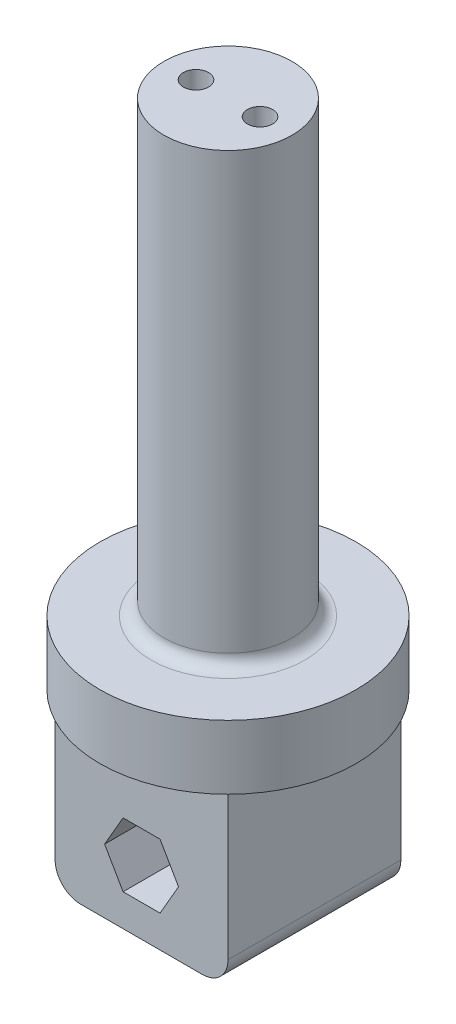
ISO-10303-21;
HEADER;
FILE_DESCRIPTION(('STEP AP214'),'2;1');
FILE_NAME('part.step','',(''),(''),'','','');
FILE_SCHEMA(('AUTOMOTIVE_DESIGN { 1 0 10303 214 1 1 1 1 }'));
ENDSEC;
DATA;
#1=APPLICATION_CONTEXT('core data for automotive mechanical design processes');
#2=APPLICATION_PROTOCOL_DEFINITION('international standard','automotive_design',2000,#1);
#3=PRODUCT_CONTEXT('',#1,'mechanical');
#4=PRODUCT('Part','Part','',(#3));
#5=PRODUCT_RELATED_PRODUCT_CATEGORY('part','',(#4));
#6=PRODUCT_DEFINITION_FORMATION('','',#4);
#7=PRODUCT_DEFINITION_CONTEXT('part definition',#1,'design');
#8=PRODUCT_DEFINITION('design','',#6,#7);
#9=PRODUCT_DEFINITION_SHAPE('','',#8);
#10=(LENGTH_UNIT() NAMED_UNIT(*) SI_UNIT(.MILLI.,.METRE.));
#11=(NAMED_UNIT(*) PLANE_ANGLE_UNIT() SI_UNIT($,.RADIAN.));
#12=(NAMED_UNIT(*) SI_UNIT($,.STERADIAN.) SOLID_ANGLE_UNIT());
#13=UNCERTAINTY_MEASURE_WITH_UNIT(LENGTH_MEASURE(1.E-05),#10,'distance_accuracy_value','');
#14=(GEOMETRIC_REPRESENTATION_CONTEXT(3) GLOBAL_UNCERTAINTY_ASSIGNED_CONTEXT((#13)) GLOBAL_UNIT_ASSIGNED_CONTEXT((#10,
#11,#12)) REPRESENTATION_CONTEXT('',''));
#15=CARTESIAN_POINT('',(0.,0.,0.));
#16=DIRECTION('',(0.,0.,1.));
#17=DIRECTION('',(1.,0.,0.));
#18=AXIS2_PLACEMENT_3D('',#15,#16,#17);
#19=CARTESIAN_POINT('',(17.145,34.31697226,0.));
#20=DIRECTION('',(-1.,0.,0.));
#21=DIRECTION('',(0.,0.,1.));
#22=AXIS2_PLACEMENT_3D('',#19,#20,#21);
#23=PLANE('',#22);
#24=DIRECTION('',(0.,-1.,0.));
#25=VECTOR('',#24,1.);
#26=CARTESIAN_POINT('',(17.145,34.31697226,17.145));
#27=LINE('',#26,#25);
#28=CARTESIAN_POINT('',(17.145,34.31697226,17.145));
#29=VERTEX_POINT('',#28);
#30=CARTESIAN_POINT('',(17.145,5.08,17.145));
#31=VERTEX_POINT('',#30);
#32=EDGE_CURVE('E227',#29,#31,#27,.T.);
#33=ORIENTED_EDGE('',*,*,#32,.T.);
#34=DIRECTION('',(0.,0.,-1.));
#35=VECTOR('',#34,1.);
#36=CARTESIAN_POINT('',(17.145,5.08,0.));
#37=LINE('',#36,#35);
#38=CARTESIAN_POINT('',(17.145,5.08,-17.145));
#39=VERTEX_POINT('',#38);
#40=EDGE_CURVE('E242',#31,#39,#37,.T.);
#41=ORIENTED_EDGE('',*,*,#40,.T.);
#42=DIRECTION('',(0.,-1.,0.));
#43=VECTOR('',#42,1.);
#44=CARTESIAN_POINT('',(17.145,34.31697226,-17.145));
#45=LINE('',#44,#43);
#46=CARTESIAN_POINT('',(17.145,34.31697226,-17.145));
#47=VERTEX_POINT('',#46);
#48=EDGE_CURVE('E239',#47,#39,#45,.T.);
#49=ORIENTED_EDGE('',*,*,#48,.F.);
#50=DIRECTION('',(0.,0.,-1.));
#51=VECTOR('',#50,1.);
#52=CARTESIAN_POINT('',(17.145,34.31697226,17.145));
#53=LINE('',#52,#51);
#54=EDGE_CURVE('E214',#29,#47,#53,.T.);
#55=ORIENTED_EDGE('',*,*,#54,.F.);
#56=EDGE_LOOP('',(#33,#41,#49,#55));
#57=FACE_BOUND('',#56,.T.);
#58=ADVANCED_FACE('F39',(#57),#23,.F.);
#59=CARTESIAN_POINT('',(0.,34.31697226,-17.145));
#60=DIRECTION('',(0.,0.,1.));
#61=DIRECTION('',(1.,0.,0.));
#62=AXIS2_PLACEMENT_3D('',#59,#60,#61);
#63=PLANE('',#62);
#64=DIRECTION('',(0.5,-0.866025403784439,0.));
#65=VECTOR('',#64,1.);
#66=CARTESIAN_POINT('',(-14.8596848790629,25.737729195,-17.145));
#67=LINE('',#66,#65);
#68=CARTESIAN_POINT('',(-7.33234841870825,12.7,-17.145));
#69=VERTEX_POINT('',#68);
#70=CARTESIAN_POINT('',(-3.66617420935412,6.35,-17.145));
#71=VERTEX_POINT('',#70);
#72=EDGE_CURVE('E198',#69,#71,#67,.T.);
#73=ORIENTED_EDGE('',*,*,#72,.T.);
#74=DIRECTION('',(1.,0.,0.));
#75=VECTOR('',#74,1.);
#76=CARTESIAN_POINT('',(0.,6.35,-17.145));
#77=LINE('',#76,#75);
#78=CARTESIAN_POINT('',(3.66617420935412,6.35,-17.145));
#79=VERTEX_POINT('',#78);
#80=EDGE_CURVE('E201',#71,#79,#77,.T.);
#81=ORIENTED_EDGE('',*,*,#80,.T.);
#82=DIRECTION('',(0.5,0.866025403784439,0.));
#83=VECTOR('',#82,1.);
#84=CARTESIAN_POINT('',(14.8596848790629,25.737729195,-17.145));
#85=LINE('',#84,#83);
#86=CARTESIAN_POINT('',(7.33234841870824,12.7,-17.145));
#87=VERTEX_POINT('',#86);
#88=EDGE_CURVE('E176',#79,#87,#85,.T.);
#89=ORIENTED_EDGE('',*,*,#88,.T.);
#90=DIRECTION('',(-0.5,0.866025403784439,0.));
#91=VECTOR('',#90,1.);
#92=CARTESIAN_POINT('',(-3.86116225100057,32.087729195,-17.145));
#93=LINE('',#92,#91);
#94=CARTESIAN_POINT('',(3.66617420935412,19.05,-17.145));
#95=VERTEX_POINT('',#94);
#96=EDGE_CURVE('E189',#87,#95,#93,.T.);
#97=ORIENTED_EDGE('',*,*,#96,.T.);
#98=DIRECTION('',(-1.,0.,0.));
#99=VECTOR('',#98,1.);
#100=CARTESIAN_POINT('',(0.,19.05,-17.145));
#101=LINE('',#100,#99);
#102=CARTESIAN_POINT('',(-3.66617420935413,19.05,-17.145));
#103=VERTEX_POINT('',#102);
#104=EDGE_CURVE('E192',#95,#103,#101,.T.);
#105=ORIENTED_EDGE('',*,*,#104,.T.);
#106=DIRECTION('',(-0.5,-0.866025403784439,0.));
#107=VECTOR('',#106,1.);
#108=CARTESIAN_POINT('',(3.86116225100056,32.087729195,-17.145));
#109=LINE('',#108,#107);
#110=EDGE_CURVE('E195',#103,#69,#109,.T.);
#111=ORIENTED_EDGE('',*,*,#110,.T.);
#112=EDGE_LOOP('',(#73,#81,#89,#97,#105,#111));
#113=FACE_BOUND('',#112,.T.);
#114=ORIENTED_EDGE('',*,*,#48,.T.);
#115=CARTESIAN_POINT('',(12.065,5.08,-17.145));
#116=DIRECTION('',(0.,0.,1.));
#117=DIRECTION('',(1.,0.,0.));
#118=AXIS2_PLACEMENT_3D('',#115,#116,#117);
#119=CIRCLE('',#118,5.08);
#120=CARTESIAN_POINT('',(12.065,0.,-17.145));
#121=VERTEX_POINT('',#120);
#122=EDGE_CURVE('E247',#39,#121,#119,.F.);
#123=ORIENTED_EDGE('',*,*,#122,.T.);
#124=DIRECTION('',(-1.,0.,0.));
#125=VECTOR('',#124,1.);
#126=CARTESIAN_POINT('',(0.,0.,-17.145));
#127=LINE('',#126,#125);
#128=CARTESIAN_POINT('',(-12.065,0.,-17.145));
#129=VERTEX_POINT('',#128);
#130=EDGE_CURVE('E211',#121,#129,#127,.T.);
#131=ORIENTED_EDGE('',*,*,#130,.T.);
#132=CARTESIAN_POINT('',(-12.065,5.08,-17.145));
#133=DIRECTION('',(0.,0.,1.));
#134=DIRECTION('',(1.,0.,0.));
#135=AXIS2_PLACEMENT_3D('',#132,#133,#134);
#136=CIRCLE('',#135,5.08);
#137=CARTESIAN_POINT('',(-17.145,5.08,-17.145));
#138=VERTEX_POINT('',#137);
#139=EDGE_CURVE('E245',#129,#138,#136,.F.);
#140=ORIENTED_EDGE('',*,*,#139,.T.);
#141=DIRECTION('',(0.,-1.,0.));
#142=VECTOR('',#141,1.);
#143=CARTESIAN_POINT('',(-17.145,34.31697226,-17.145));
#144=LINE('',#143,#142);
#145=CARTESIAN_POINT('',(-17.145,34.31697226,-17.145));
#146=VERTEX_POINT('',#145);
#147=EDGE_CURVE('E236',#146,#138,#144,.T.);
#148=ORIENTED_EDGE('',*,*,#147,.F.);
#149=DIRECTION('',(-1.,0.,0.));
#150=VECTOR('',#149,1.);
#151=CARTESIAN_POINT('',(17.145,34.31697226,-17.145));
#152=LINE('',#151,#150);
#153=EDGE_CURVE('E217',#47,#146,#152,.T.);
#154=ORIENTED_EDGE('',*,*,#153,.F.);
#155=EDGE_LOOP('',(#114,#123,#131,#140,#148,#154));
#156=FACE_BOUND('',#155,.T.);
#157=ADVANCED_FACE('F277',(#113,#156),#63,.F.);
#158=CARTESIAN_POINT('',(-17.145,34.31697226,0.));
#159=DIRECTION('',(1.,0.,0.));
#160=DIRECTION('',(0.,0.,-1.));
#161=AXIS2_PLACEMENT_3D('',#158,#159,#160);
#162=PLANE('',#161);
#163=ORIENTED_EDGE('',*,*,#147,.T.);
#164=DIRECTION('',(0.,0.,1.));
#165=VECTOR('',#164,1.);
#166=CARTESIAN_POINT('',(-17.145,5.08,0.));
#167=LINE('',#166,#165);
#168=CARTESIAN_POINT('',(-17.145,5.08,17.145));
#169=VERTEX_POINT('',#168);
#170=EDGE_CURVE('E255',#138,#169,#167,.T.);
#171=ORIENTED_EDGE('',*,*,#170,.T.);
#172=DIRECTION('',(0.,-1.,0.));
#173=VECTOR('',#172,1.);
#174=CARTESIAN_POINT('',(-17.145,34.31697226,17.145));
#175=LINE('',#174,#173);
#176=CARTESIAN_POINT('',(-17.145,34.31697226,17.145));
#177=VERTEX_POINT('',#176);
#178=EDGE_CURVE('E233',#177,#169,#175,.T.);
#179=ORIENTED_EDGE('',*,*,#178,.F.);
#180=DIRECTION('',(0.,0.,1.));
#181=VECTOR('',#180,1.);
#182=CARTESIAN_POINT('',(-17.145,34.31697226,-17.145));
#183=LINE('',#182,#181);
#184=EDGE_CURVE('E221',#146,#177,#183,.T.);
#185=ORIENTED_EDGE('',*,*,#184,.F.);
#186=EDGE_LOOP('',(#163,#171,#179,#185));
#187=FACE_BOUND('',#186,.T.);
#188=ADVANCED_FACE('F284',(#187),#162,.F.);
#189=CARTESIAN_POINT('',(0.,34.31697226,17.145));
#190=DIRECTION('',(0.,0.,-1.));
#191=DIRECTION('',(-1.,0.,0.));
#192=AXIS2_PLACEMENT_3D('',#189,#190,#191);
#193=PLANE('',#192);
#194=DIRECTION('',(0.5,0.866025403784439,0.));
#195=VECTOR('',#194,1.);
#196=CARTESIAN_POINT('',(0.,0.,17.145));
#197=LINE('',#196,#195);
#198=CARTESIAN_POINT('',(3.66617420935412,6.35,17.145));
#199=VERTEX_POINT('',#198);
#200=CARTESIAN_POINT('',(7.33234841870825,12.7,17.145));
#201=VERTEX_POINT('',#200);
#202=EDGE_CURVE('E158',#199,#201,#197,.T.);
#203=ORIENTED_EDGE('',*,*,#202,.F.);
#204=DIRECTION('',(1.,0.,0.));
#205=VECTOR('',#204,1.);
#206=CARTESIAN_POINT('',(0.,6.35,17.145));
#207=LINE('',#206,#205);
#208=CARTESIAN_POINT('',(-3.66617420935412,6.35,17.145));
#209=VERTEX_POINT('',#208);
#210=EDGE_CURVE('E156',#209,#199,#207,.T.);
#211=ORIENTED_EDGE('',*,*,#210,.F.);
#212=DIRECTION('',(0.5,-0.866025403784439,0.));
#213=VECTOR('',#212,1.);
#214=CARTESIAN_POINT('',(0.,0.,17.145));
#215=LINE('',#214,#213);
#216=CARTESIAN_POINT('',(-7.33234841870825,12.7,17.145));
#217=VERTEX_POINT('',#216);
#218=EDGE_CURVE('E170',#217,#209,#215,.T.);
#219=ORIENTED_EDGE('',*,*,#218,.F.);
#220=DIRECTION('',(-0.5,-0.866025403784439,0.));
#221=VECTOR('',#220,1.);
#222=CARTESIAN_POINT('',(-10.9985226280624,6.35,17.145));
#223=LINE('',#222,#221);
#224=CARTESIAN_POINT('',(-3.66617420935413,19.05,17.145));
#225=VERTEX_POINT('',#224);
#226=EDGE_CURVE('E167',#225,#217,#223,.T.);
#227=ORIENTED_EDGE('',*,*,#226,.F.);
#228=DIRECTION('',(-1.,0.,0.));
#229=VECTOR('',#228,1.);
#230=CARTESIAN_POINT('',(0.,19.05,17.145));
#231=LINE('',#230,#229);
#232=CARTESIAN_POINT('',(3.66617420935412,19.05,17.145));
#233=VERTEX_POINT('',#232);
#234=EDGE_CURVE('E164',#233,#225,#231,.T.);
#235=ORIENTED_EDGE('',*,*,#234,.F.);
#236=DIRECTION('',(-0.5,0.866025403784439,0.));
#237=VECTOR('',#236,1.);
#238=CARTESIAN_POINT('',(10.9985226280624,6.35,17.145));
#239=LINE('',#238,#237);
#240=EDGE_CURVE('E161',#201,#233,#239,.T.);
#241=ORIENTED_EDGE('',*,*,#240,.F.);
#242=EDGE_LOOP('',(#203,#211,#219,#227,#235,#241));
#243=FACE_BOUND('',#242,.T.);
#244=DIRECTION('',(1.,0.,0.));
#245=VECTOR('',#244,1.);
#246=CARTESIAN_POINT('',(0.,0.,17.145));
#247=LINE('',#246,#245);
#248=CARTESIAN_POINT('',(-12.065,0.,17.145));
#249=VERTEX_POINT('',#248);
#250=CARTESIAN_POINT('',(12.065,0.,17.145));
#251=VERTEX_POINT('',#250);
#252=EDGE_CURVE('E218',#249,#251,#247,.T.);
#253=ORIENTED_EDGE('',*,*,#252,.T.);
#254=CARTESIAN_POINT('',(12.065,5.08,17.145));
#255=DIRECTION('',(0.,0.,-1.));
#256=DIRECTION('',(-1.,0.,0.));
#257=AXIS2_PLACEMENT_3D('',#254,#255,#256);
#258=CIRCLE('',#257,5.08);
#259=EDGE_CURVE('E253',#251,#31,#258,.F.);
#260=ORIENTED_EDGE('',*,*,#259,.T.);
#261=ORIENTED_EDGE('',*,*,#32,.F.);
#262=DIRECTION('',(1.,0.,0.));
#263=VECTOR('',#262,1.);
#264=CARTESIAN_POINT('',(-17.145,34.31697226,17.145));
#265=LINE('',#264,#263);
#266=EDGE_CURVE('E224',#177,#29,#265,.T.);
#267=ORIENTED_EDGE('',*,*,#266,.F.);
#268=ORIENTED_EDGE('',*,*,#178,.T.);
#269=CARTESIAN_POINT('',(-12.065,5.08,17.145));
#270=DIRECTION('',(0.,0.,-1.));
#271=DIRECTION('',(-1.,0.,0.));
#272=AXIS2_PLACEMENT_3D('',#269,#270,#271);
#273=CIRCLE('',#272,5.08);
#274=EDGE_CURVE('E54',#169,#249,#273,.F.);
#275=ORIENTED_EDGE('',*,*,#274,.T.);
#276=EDGE_LOOP('',(#253,#260,#261,#267,#268,#275));
#277=FACE_BOUND('',#276,.T.);
#278=ADVANCED_FACE('F302',(#243,#277),#193,.F.);
#279=CARTESIAN_POINT('',(0.,0.,0.));
#280=DIRECTION('',(0.,1.,0.));
#281=DIRECTION('',(0.,0.,1.));
#282=AXIS2_PLACEMENT_3D('',#279,#280,#281);
#283=PLANE('',#282);
#284=ORIENTED_EDGE('',*,*,#130,.F.);
#285=DIRECTION('',(0.,0.,-1.));
#286=VECTOR('',#285,1.);
#287=CARTESIAN_POINT('',(12.065,0.,0.));
#288=LINE('',#287,#286);
#289=EDGE_CURVE('E62',#121,#251,#288,.F.);
#290=ORIENTED_EDGE('',*,*,#289,.T.);
#291=ORIENTED_EDGE('',*,*,#252,.F.);
#292=DIRECTION('',(0.,0.,1.));
#293=VECTOR('',#292,1.);
#294=CARTESIAN_POINT('',(-12.065,0.,0.));
#295=LINE('',#294,#293);
#296=EDGE_CURVE('E249',#249,#129,#295,.F.);
#297=ORIENTED_EDGE('',*,*,#296,.T.);
#298=EDGE_LOOP('',(#284,#290,#291,#297));
#299=FACE_BOUND('',#298,.T.);
#300=ADVANCED_FACE('F311',(#299),#283,.F.);
#301=CARTESIAN_POINT('',(0.,34.31697226,0.));
#302=DIRECTION('',(0.,1.,0.));
#303=DIRECTION('',(0.,0.,1.));
#304=AXIS2_PLACEMENT_3D('',#301,#302,#303);
#305=PLANE('',#304);
#306=CARTESIAN_POINT('',(0.,34.31697226,0.));
#307=DIRECTION('',(0.,1.,0.));
#308=DIRECTION('',(0.,0.,1.));
#309=AXIS2_PLACEMENT_3D('',#306,#307,#308);
#310=CIRCLE('',#309,25.4);
#311=CARTESIAN_POINT('',(0.,34.31697226,25.4));
#312=VERTEX_POINT('',#311);
#313=EDGE_CURVE('E207',#312,#312,#310,.T.);
#314=ORIENTED_EDGE('',*,*,#313,.F.);
#315=EDGE_LOOP('',(#314));
#316=FACE_BOUND('',#315,.T.);
#317=ORIENTED_EDGE('',*,*,#266,.T.);
#318=ORIENTED_EDGE('',*,*,#54,.T.);
#319=ORIENTED_EDGE('',*,*,#153,.T.);
#320=ORIENTED_EDGE('',*,*,#184,.T.);
#321=EDGE_LOOP('',(#317,#318,#319,#320));
#322=FACE_BOUND('',#321,.T.);
#323=ADVANCED_FACE('F306',(#316,#322),#305,.F.);
#324=CARTESIAN_POINT('',(0.,47.01697226,0.));
#325=DIRECTION('',(0.,-1.,0.));
#326=DIRECTION('',(0.,0.,-1.));
#327=AXIS2_PLACEMENT_3D('',#324,#325,#326);
#328=CYLINDRICAL_SURFACE('',#327,25.4);
#329=CARTESIAN_POINT('',(0.,47.01697226,0.));
#330=DIRECTION('',(0.,1.,0.));
#331=DIRECTION('',(0.,0.,1.));
#332=AXIS2_PLACEMENT_3D('',#329,#330,#331);
#333=CIRCLE('',#332,25.4);
#334=CARTESIAN_POINT('',(0.,47.01697226,25.4));
#335=VERTEX_POINT('',#334);
#336=EDGE_CURVE('E208',#335,#335,#333,.T.);
#337=ORIENTED_EDGE('',*,*,#336,.F.);
#338=EDGE_LOOP('',(#337));
#339=FACE_BOUND('',#338,.T.);
#340=ORIENTED_EDGE('',*,*,#313,.T.);
#341=EDGE_LOOP('',(#340));
#342=FACE_BOUND('',#341,.T.);
#343=ADVANCED_FACE('F317',(#339,#342),#328,.T.);
#344=CARTESIAN_POINT('',(0.,47.01697226,0.));
#345=DIRECTION('',(0.,1.,0.));
#346=DIRECTION('',(0.,0.,1.));
#347=AXIS2_PLACEMENT_3D('',#344,#345,#346);
#348=PLANE('',#347);
#349=CARTESIAN_POINT('',(0.,47.01697226,0.));
#350=DIRECTION('',(0.,1.,0.));
#351=DIRECTION('',(0.,0.,1.));
#352=AXIS2_PLACEMENT_3D('',#349,#350,#351);
#353=CIRCLE('',#352,15.24);
#354=CARTESIAN_POINT('',(0.,47.01697226,15.24));
#355=VERTEX_POINT('',#354);
#356=EDGE_CURVE('E11',#355,#355,#353,.F.);
#357=ORIENTED_EDGE('',*,*,#356,.T.);
#358=EDGE_LOOP('',(#357));
#359=FACE_BOUND('',#358,.T.);
#360=ORIENTED_EDGE('',*,*,#336,.T.);
#361=EDGE_LOOP('',(#360));
#362=FACE_BOUND('',#361,.T.);
#363=ADVANCED_FACE('F355',(#359,#362),#348,.T.);
#364=CARTESIAN_POINT('',(0.,135.91697226,0.));
#365=DIRECTION('',(0.,-1.,0.));
#366=DIRECTION('',(0.,0.,-1.));
#367=AXIS2_PLACEMENT_3D('',#364,#365,#366);
#368=CYLINDRICAL_SURFACE('',#367,12.7);
#369=CARTESIAN_POINT('',(0.,49.55697226,0.));
#370=DIRECTION('',(0.,1.,0.));
#371=DIRECTION('',(0.,0.,1.));
#372=AXIS2_PLACEMENT_3D('',#369,#370,#371);
#373=CIRCLE('',#372,12.7);
#374=CARTESIAN_POINT('',(0.,49.55697226,12.7));
#375=VERTEX_POINT('',#374);
#376=EDGE_CURVE('E47',#375,#375,#373,.T.);
#377=ORIENTED_EDGE('',*,*,#376,.T.);
#378=EDGE_LOOP('',(#377));
#379=FACE_BOUND('',#378,.T.);
#380=CARTESIAN_POINT('',(0.,135.91697226,0.));
#381=DIRECTION('',(0.,1.,0.));
#382=DIRECTION('',(0.,0.,1.));
#383=AXIS2_PLACEMENT_3D('',#380,#381,#382);
#384=CIRCLE('',#383,12.7);
#385=CARTESIAN_POINT('',(0.,135.91697226,12.7));
#386=VERTEX_POINT('',#385);
#387=EDGE_CURVE('E204',#386,#386,#384,.T.);
#388=ORIENTED_EDGE('',*,*,#387,.F.);
#389=EDGE_LOOP('',(#388));
#390=FACE_BOUND('',#389,.T.);
#391=ADVANCED_FACE('F259',(#379,#390),#368,.T.);
#392=CARTESIAN_POINT('',(0.,135.91697226,0.));
#393=DIRECTION('',(0.,1.,0.));
#394=DIRECTION('',(0.,0.,1.));
#395=AXIS2_PLACEMENT_3D('',#392,#393,#394);
#396=PLANE('',#395);
#397=CARTESIAN_POINT('',(6.35,135.91697226,0.));
#398=DIRECTION('',(0.,1.,0.));
#399=DIRECTION('',(0.,0.,1.));
#400=AXIS2_PLACEMENT_3D('',#397,#398,#399);
#401=CIRCLE('',#400,2.49999999999999);
#402=CARTESIAN_POINT('',(6.35,135.91697226,2.49999999999999));
#403=VERTEX_POINT('',#402);
#404=EDGE_CURVE('E146',#403,#403,#401,.T.);
#405=ORIENTED_EDGE('',*,*,#404,.F.);
#406=EDGE_LOOP('',(#405));
#407=FACE_BOUND('',#406,.T.);
#408=CARTESIAN_POINT('',(-6.35,135.91697226,0.));
#409=DIRECTION('',(0.,1.,0.));
#410=DIRECTION('',(0.,0.,1.));
#411=AXIS2_PLACEMENT_3D('',#408,#409,#410);
#412=CIRCLE('',#411,2.49999999999999);
#413=CARTESIAN_POINT('',(-6.35,135.91697226,2.49999999999999));
#414=VERTEX_POINT('',#413);
#415=EDGE_CURVE('E145',#414,#414,#412,.T.);
#416=ORIENTED_EDGE('',*,*,#415,.F.);
#417=EDGE_LOOP('',(#416));
#418=FACE_BOUND('',#417,.T.);
#419=ORIENTED_EDGE('',*,*,#387,.T.);
#420=EDGE_LOOP('',(#419));
#421=FACE_BOUND('',#420,.T.);
#422=ADVANCED_FACE('F373',(#407,#418,#421),#396,.T.);
#423=CARTESIAN_POINT('',(0.,6.35,-25.4));
#424=DIRECTION('',(0.,-1.,0.));
#425=DIRECTION('',(1.,0.,0.));
#426=AXIS2_PLACEMENT_3D('',#423,#424,#425);
#427=PLANE('',#426);
#428=DIRECTION('',(0.,0.,1.));
#429=VECTOR('',#428,1.);
#430=CARTESIAN_POINT('',(-3.66617420935412,6.35,-25.4));
#431=LINE('',#430,#429);
#432=EDGE_CURVE('E174',#71,#209,#431,.T.);
#433=ORIENTED_EDGE('',*,*,#432,.T.);
#434=ORIENTED_EDGE('',*,*,#210,.T.);
#435=DIRECTION('',(0.,0.,1.));
#436=VECTOR('',#435,1.);
#437=CARTESIAN_POINT('',(3.66617420935412,6.35,-25.4));
#438=LINE('',#437,#436);
#439=EDGE_CURVE('E173',#79,#199,#438,.T.);
#440=ORIENTED_EDGE('',*,*,#439,.F.);
#441=ORIENTED_EDGE('',*,*,#80,.F.);
#442=EDGE_LOOP('',(#433,#434,#440,#441));
#443=FACE_BOUND('',#442,.T.);
#444=ADVANCED_FACE('F381',(#443),#427,.F.);
#445=CARTESIAN_POINT('',(0.,0.,-25.4));
#446=DIRECTION('',(-0.866025403784439,-0.5,0.));
#447=DIRECTION('',(0.5,-0.866025403784439,0.));
#448=AXIS2_PLACEMENT_3D('',#445,#446,#447);
#449=PLANE('',#448);
#450=DIRECTION('',(0.,0.,1.));
#451=VECTOR('',#450,1.);
#452=CARTESIAN_POINT('',(-7.33234841870825,12.7,-25.4));
#453=LINE('',#452,#451);
#454=EDGE_CURVE('E177',#69,#217,#453,.T.);
#455=ORIENTED_EDGE('',*,*,#454,.T.);
#456=ORIENTED_EDGE('',*,*,#218,.T.);
#457=ORIENTED_EDGE('',*,*,#432,.F.);
#458=ORIENTED_EDGE('',*,*,#72,.F.);
#459=EDGE_LOOP('',(#455,#456,#457,#458));
#460=FACE_BOUND('',#459,.T.);
#461=ADVANCED_FACE('F390',(#460),#449,.F.);
#462=CARTESIAN_POINT('',(-10.9985226280624,6.35,-25.4));
#463=DIRECTION('',(-0.866025403784439,0.5,0.));
#464=DIRECTION('',(-0.5,-0.866025403784439,0.));
#465=AXIS2_PLACEMENT_3D('',#462,#463,#464);
#466=PLANE('',#465);
#467=DIRECTION('',(0.,0.,1.));
#468=VECTOR('',#467,1.);
#469=CARTESIAN_POINT('',(-3.66617420935413,19.05,-25.4));
#470=LINE('',#469,#468);
#471=EDGE_CURVE('E179',#103,#225,#470,.T.);
#472=ORIENTED_EDGE('',*,*,#471,.T.);
#473=ORIENTED_EDGE('',*,*,#226,.T.);
#474=ORIENTED_EDGE('',*,*,#454,.F.);
#475=ORIENTED_EDGE('',*,*,#110,.F.);
#476=EDGE_LOOP('',(#472,#473,#474,#475));
#477=FACE_BOUND('',#476,.T.);
#478=ADVANCED_FACE('F400',(#477),#466,.F.);
#479=CARTESIAN_POINT('',(0.,19.05,-25.4));
#480=DIRECTION('',(0.,1.,0.));
#481=DIRECTION('',(0.,0.,1.));
#482=AXIS2_PLACEMENT_3D('',#479,#480,#481);
#483=PLANE('',#482);
#484=DIRECTION('',(0.,0.,1.));
#485=VECTOR('',#484,1.);
#486=CARTESIAN_POINT('',(3.66617420935412,19.05,-25.4));
#487=LINE('',#486,#485);
#488=EDGE_CURVE('E181',#95,#233,#487,.T.);
#489=ORIENTED_EDGE('',*,*,#488,.T.);
#490=ORIENTED_EDGE('',*,*,#234,.T.);
#491=ORIENTED_EDGE('',*,*,#471,.F.);
#492=ORIENTED_EDGE('',*,*,#104,.F.);
#493=EDGE_LOOP('',(#489,#490,#491,#492));
#494=FACE_BOUND('',#493,.T.);
#495=ADVANCED_FACE('F410',(#494),#483,.F.);
#496=CARTESIAN_POINT('',(10.9985226280624,6.35,-25.4));
#497=DIRECTION('',(0.866025403784439,0.5,0.));
#498=DIRECTION('',(-0.5,0.866025403784439,0.));
#499=AXIS2_PLACEMENT_3D('',#496,#497,#498);
#500=PLANE('',#499);
#501=DIRECTION('',(0.,0.,1.));
#502=VECTOR('',#501,1.);
#503=CARTESIAN_POINT('',(7.33234841870825,12.7,-25.4));
#504=LINE('',#503,#502);
#505=EDGE_CURVE('E183',#87,#201,#504,.T.);
#506=ORIENTED_EDGE('',*,*,#505,.T.);
#507=ORIENTED_EDGE('',*,*,#240,.T.);
#508=ORIENTED_EDGE('',*,*,#488,.F.);
#509=ORIENTED_EDGE('',*,*,#96,.F.);
#510=EDGE_LOOP('',(#506,#507,#508,#509));
#511=FACE_BOUND('',#510,.T.);
#512=ADVANCED_FACE('F295',(#511),#500,.F.);
#513=CARTESIAN_POINT('',(0.,0.,-25.4));
#514=DIRECTION('',(0.866025403784439,-0.5,0.));
#515=DIRECTION('',(0.5,0.866025403784439,0.));
#516=AXIS2_PLACEMENT_3D('',#513,#514,#515);
#517=PLANE('',#516);
#518=ORIENTED_EDGE('',*,*,#439,.T.);
#519=ORIENTED_EDGE('',*,*,#202,.T.);
#520=ORIENTED_EDGE('',*,*,#505,.F.);
#521=ORIENTED_EDGE('',*,*,#88,.F.);
#522=EDGE_LOOP('',(#518,#519,#520,#521));
#523=FACE_BOUND('',#522,.T.);
#524=ADVANCED_FACE('F290',(#523),#517,.F.);
#525=CARTESIAN_POINT('',(12.065,5.08,0.));
#526=DIRECTION('',(0.,0.,-1.));
#527=DIRECTION('',(-1.,0.,0.));
#528=AXIS2_PLACEMENT_3D('',#525,#526,#527);
#529=CYLINDRICAL_SURFACE('',#528,5.08);
#530=ORIENTED_EDGE('',*,*,#259,.F.);
#531=ORIENTED_EDGE('',*,*,#289,.F.);
#532=ORIENTED_EDGE('',*,*,#122,.F.);
#533=ORIENTED_EDGE('',*,*,#40,.F.);
#534=EDGE_LOOP('',(#530,#531,#532,#533));
#535=FACE_BOUND('',#534,.T.);
#536=ADVANCED_FACE('F274',(#535),#529,.T.);
#537=CARTESIAN_POINT('',(-12.065,5.08,0.));
#538=DIRECTION('',(0.,0.,1.));
#539=DIRECTION('',(1.,0.,0.));
#540=AXIS2_PLACEMENT_3D('',#537,#538,#539);
#541=CYLINDRICAL_SURFACE('',#540,5.08);
#542=ORIENTED_EDGE('',*,*,#139,.F.);
#543=ORIENTED_EDGE('',*,*,#296,.F.);
#544=ORIENTED_EDGE('',*,*,#274,.F.);
#545=ORIENTED_EDGE('',*,*,#170,.F.);
#546=EDGE_LOOP('',(#542,#543,#544,#545));
#547=FACE_BOUND('',#546,.T.);
#548=ADVANCED_FACE('F264',(#547),#541,.T.);
#549=CARTESIAN_POINT('',(0.,49.55697226,0.));
#550=DIRECTION('',(0.,1.,0.));
#551=DIRECTION('',(0.,0.,1.));
#552=AXIS2_PLACEMENT_3D('',#549,#550,#551);
#553=TOROIDAL_SURFACE('',#552,15.24,2.54);
#554=ORIENTED_EDGE('',*,*,#356,.F.);
#555=EDGE_LOOP('',(#554));
#556=FACE_BOUND('',#555,.T.);
#557=ORIENTED_EDGE('',*,*,#376,.F.);
#558=EDGE_LOOP('',(#557));
#559=FACE_BOUND('',#558,.T.);
#560=ADVANCED_FACE('F41',(#556,#559),#553,.F.);
#561=CARTESIAN_POINT('',(-6.35,97.81697226,0.));
#562=DIRECTION('',(0.,1.,0.));
#563=DIRECTION('',(0.,0.,1.));
#564=AXIS2_PLACEMENT_3D('',#561,#562,#563);
#565=CONICAL_SURFACE('',#564,2.49999999999999,1.02974425867665);
#566=CARTESIAN_POINT('',(-6.35000000000001,96.3148207124311,0.));
#567=VERTEX_POINT('',#566);
#568=VERTEX_LOOP('',#567);
#569=FACE_BOUND('',#568,.T.);
#570=CARTESIAN_POINT('',(-6.35,97.81697226,0.));
#571=DIRECTION('',(0.,1.,0.));
#572=DIRECTION('',(0.,0.,1.));
#573=AXIS2_PLACEMENT_3D('',#570,#571,#572);
#574=CIRCLE('',#573,2.49999999999999);
#575=CARTESIAN_POINT('',(-6.35,97.81697226,2.49999999999999));
#576=VERTEX_POINT('',#575);
#577=EDGE_CURVE('E149',#576,#576,#574,.T.);
#578=ORIENTED_EDGE('',*,*,#577,.T.);
#579=EDGE_LOOP('',(#578));
#580=FACE_BOUND('',#579,.T.);
#581=ADVANCED_FACE('F263',(#569,#580),#565,.F.);
#582=CARTESIAN_POINT('',(-6.35,135.91697226,0.));
#583=DIRECTION('',(0.,1.,0.));
#584=DIRECTION('',(0.,0.,1.));
#585=AXIS2_PLACEMENT_3D('',#582,#583,#584);
#586=CYLINDRICAL_SURFACE('',#585,2.49999999999999);
#587=ORIENTED_EDGE('',*,*,#577,.F.);
#588=EDGE_LOOP('',(#587));
#589=FACE_BOUND('',#588,.T.);
#590=ORIENTED_EDGE('',*,*,#415,.T.);
#591=EDGE_LOOP('',(#590));
#592=FACE_BOUND('',#591,.T.);
#593=ADVANCED_FACE('F139',(#589,#592),#586,.F.);
#594=CARTESIAN_POINT('',(6.35,97.81697226,0.));
#595=DIRECTION('',(0.,1.,0.));
#596=DIRECTION('',(0.,0.,1.));
#597=AXIS2_PLACEMENT_3D('',#594,#595,#596);
#598=CONICAL_SURFACE('',#597,2.5,1.02974425867665);
#599=CARTESIAN_POINT('',(6.34999999999999,96.3148207124311,0.));
#600=VERTEX_POINT('',#599);
#601=VERTEX_LOOP('',#600);
#602=FACE_BOUND('',#601,.T.);
#603=CARTESIAN_POINT('',(6.35,97.81697226,0.));
#604=DIRECTION('',(0.,1.,0.));
#605=DIRECTION('',(0.,0.,1.));
#606=AXIS2_PLACEMENT_3D('',#603,#604,#605);
#607=CIRCLE('',#606,2.5);
#608=CARTESIAN_POINT('',(6.35,97.81697226,2.5));
#609=VERTEX_POINT('',#608);
#610=EDGE_CURVE('E143',#609,#609,#607,.T.);
#611=ORIENTED_EDGE('',*,*,#610,.T.);
#612=EDGE_LOOP('',(#611));
#613=FACE_BOUND('',#612,.T.);
#614=ADVANCED_FACE('F135',(#602,#613),#598,.F.);
#615=CARTESIAN_POINT('',(6.35,135.91697226,0.));
#616=DIRECTION('',(0.,1.,0.));
#617=DIRECTION('',(0.,0.,1.));
#618=AXIS2_PLACEMENT_3D('',#615,#616,#617);
#619=CYLINDRICAL_SURFACE('',#618,2.49999999999999);
#620=ORIENTED_EDGE('',*,*,#610,.F.);
#621=EDGE_LOOP('',(#620));
#622=FACE_BOUND('',#621,.T.);
#623=ORIENTED_EDGE('',*,*,#404,.T.);
#624=EDGE_LOOP('',(#623));
#625=FACE_BOUND('',#624,.T.);
#626=ADVANCED_FACE('F138',(#622,#625),#619,.F.);
#627=CLOSED_SHELL('',(#58,#157,#188,#278,#300,#323,#343,#363,#391,#422,#444,#461,#478,#495,#512,
#524,#536,#548,#560,#581,#593,#614,#626));
#628=MANIFOLD_SOLID_BREP('B2',#627);
#629=ADVANCED_BREP_SHAPE_REPRESENTATION('',(#18,#628),#14);
#630=SHAPE_DEFINITION_REPRESENTATION(#9,#629);
ENDSEC;
END-ISO-10303-21;
